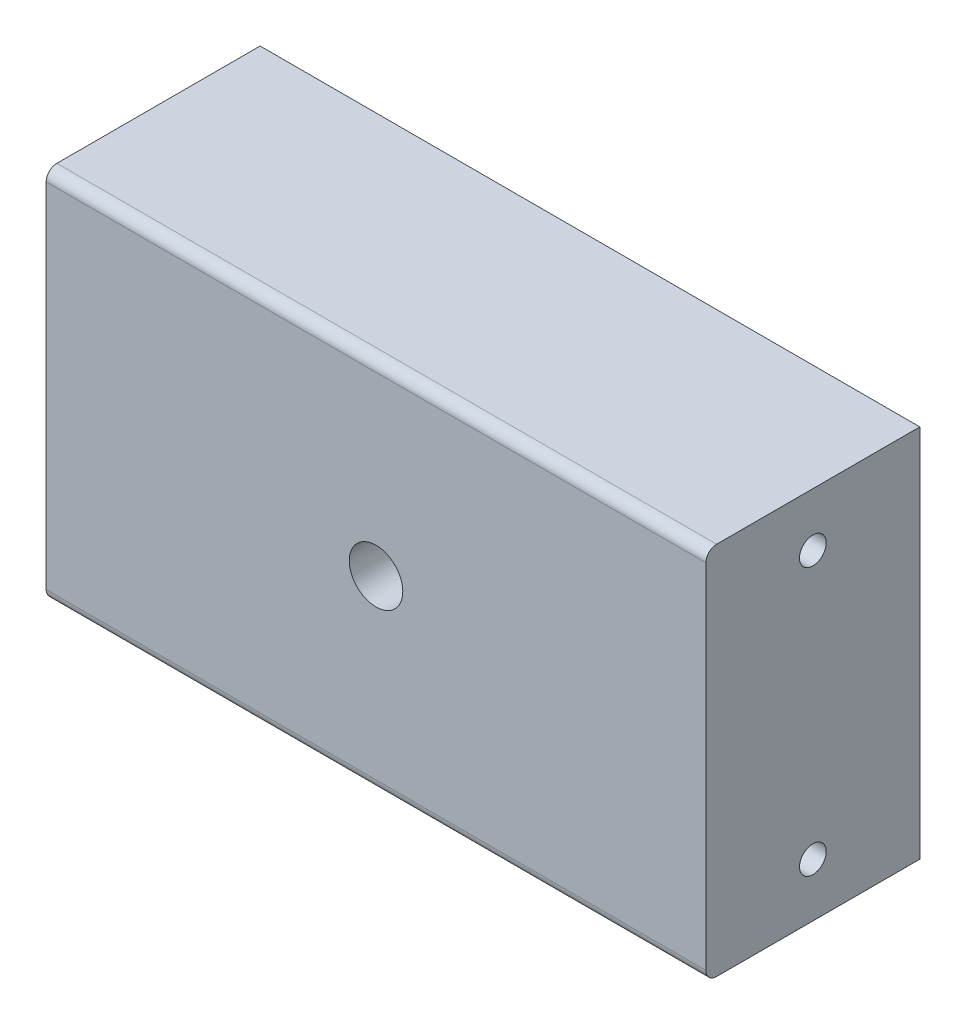
ISO-10303-21;
HEADER;
FILE_DESCRIPTION(('STEP AP214'),'2;1');
FILE_NAME('part.step','',(''),(''),'','','');
FILE_SCHEMA(('AUTOMOTIVE_DESIGN { 1 0 10303 214 1 1 1 1 }'));
ENDSEC;
DATA;
#1=APPLICATION_CONTEXT('core data for automotive mechanical design processes');
#2=APPLICATION_PROTOCOL_DEFINITION('international standard','automotive_design',2000,#1);
#3=PRODUCT_CONTEXT('',#1,'mechanical');
#4=PRODUCT('Part','Part','',(#3));
#5=PRODUCT_RELATED_PRODUCT_CATEGORY('part','',(#4));
#6=PRODUCT_DEFINITION_FORMATION('','',#4);
#7=PRODUCT_DEFINITION_CONTEXT('part definition',#1,'design');
#8=PRODUCT_DEFINITION('design','',#6,#7);
#9=PRODUCT_DEFINITION_SHAPE('','',#8);
#10=(LENGTH_UNIT() NAMED_UNIT(*) SI_UNIT(.MILLI.,.METRE.));
#11=(NAMED_UNIT(*) PLANE_ANGLE_UNIT() SI_UNIT($,.RADIAN.));
#12=(NAMED_UNIT(*) SI_UNIT($,.STERADIAN.) SOLID_ANGLE_UNIT());
#13=UNCERTAINTY_MEASURE_WITH_UNIT(LENGTH_MEASURE(1.E-05),#10,'distance_accuracy_value','');
#14=(GEOMETRIC_REPRESENTATION_CONTEXT(3) GLOBAL_UNCERTAINTY_ASSIGNED_CONTEXT((#13)) GLOBAL_UNIT_ASSIGNED_CONTEXT((#10,
#11,#12)) REPRESENTATION_CONTEXT('',''));
#15=CARTESIAN_POINT('',(0.,0.,0.));
#16=DIRECTION('',(0.,0.,1.));
#17=DIRECTION('',(1.,0.,0.));
#18=AXIS2_PLACEMENT_3D('',#15,#16,#17);
#19=CARTESIAN_POINT('',(-30.8375,17.5,-20.));
#20=DIRECTION('',(-1.,0.,0.));
#21=DIRECTION('',(0.,0.,1.));
#22=AXIS2_PLACEMENT_3D('',#19,#20,#21);
#23=PLANE('',#22);
#24=CARTESIAN_POINT('',(-30.8375,12.5,-10.));
#25=DIRECTION('',(-1.,0.,0.));
#26=DIRECTION('',(0.,0.,1.));
#27=AXIS2_PLACEMENT_3D('',#24,#25,#26);
#28=CIRCLE('',#27,1.24999999999999);
#29=CARTESIAN_POINT('',(-30.8375,12.5,-8.75000000000001));
#30=VERTEX_POINT('',#29);
#31=EDGE_CURVE('E117',#30,#30,#28,.T.);
#32=ORIENTED_EDGE('',*,*,#31,.F.);
#33=EDGE_LOOP('',(#32));
#34=FACE_BOUND('',#33,.T.);
#35=CARTESIAN_POINT('',(-30.8375,-12.5,-10.));
#36=DIRECTION('',(-1.,0.,0.));
#37=DIRECTION('',(0.,0.,1.));
#38=AXIS2_PLACEMENT_3D('',#35,#36,#37);
#39=CIRCLE('',#38,1.24999999999999);
#40=CARTESIAN_POINT('',(-30.8375,-12.5,-8.75000000000001));
#41=VERTEX_POINT('',#40);
#42=EDGE_CURVE('E116',#41,#41,#39,.T.);
#43=ORIENTED_EDGE('',*,*,#42,.F.);
#44=EDGE_LOOP('',(#43));
#45=FACE_BOUND('',#44,.T.);
#46=DIRECTION('',(0.,0.,1.));
#47=VECTOR('',#46,1.);
#48=CARTESIAN_POINT('',(-30.8375,-17.5,-20.));
#49=LINE('',#48,#47);
#50=CARTESIAN_POINT('',(-30.8375,-17.5,-20.));
#51=VERTEX_POINT('',#50);
#52=CARTESIAN_POINT('',(-30.8375,-17.5,-1.));
#53=VERTEX_POINT('',#52);
#54=EDGE_CURVE('E170',#51,#53,#49,.T.);
#55=ORIENTED_EDGE('',*,*,#54,.T.);
#56=CARTESIAN_POINT('',(-30.8375,-16.5,-1.));
#57=DIRECTION('',(-1.,0.,0.));
#58=DIRECTION('',(0.,0.,1.));
#59=AXIS2_PLACEMENT_3D('',#56,#57,#58);
#60=CIRCLE('',#59,1.);
#61=CARTESIAN_POINT('',(-30.8375,-16.5,0.));
#62=VERTEX_POINT('',#61);
#63=EDGE_CURVE('E48',#53,#62,#60,.T.);
#64=ORIENTED_EDGE('',*,*,#63,.T.);
#65=DIRECTION('',(0.,-1.,0.));
#66=VECTOR('',#65,1.);
#67=CARTESIAN_POINT('',(-30.8375,17.5,0.));
#68=LINE('',#67,#66);
#69=CARTESIAN_POINT('',(-30.8375,16.5,0.));
#70=VERTEX_POINT('',#69);
#71=EDGE_CURVE('E154',#70,#62,#68,.T.);
#72=ORIENTED_EDGE('',*,*,#71,.F.);
#73=CARTESIAN_POINT('',(-30.8375,16.5,-1.));
#74=DIRECTION('',(-1.,0.,0.));
#75=DIRECTION('',(0.,0.,1.));
#76=AXIS2_PLACEMENT_3D('',#73,#74,#75);
#77=CIRCLE('',#76,1.);
#78=CARTESIAN_POINT('',(-30.8375,17.5,-1.));
#79=VERTEX_POINT('',#78);
#80=EDGE_CURVE('E55',#70,#79,#77,.T.);
#81=ORIENTED_EDGE('',*,*,#80,.T.);
#82=DIRECTION('',(0.,0.,1.));
#83=VECTOR('',#82,1.);
#84=CARTESIAN_POINT('',(-30.8375,17.5,-20.));
#85=LINE('',#84,#83);
#86=CARTESIAN_POINT('',(-30.8375,17.5,-20.));
#87=VERTEX_POINT('',#86);
#88=EDGE_CURVE('E177',#87,#79,#85,.T.);
#89=ORIENTED_EDGE('',*,*,#88,.F.);
#90=DIRECTION('',(0.,-1.,0.));
#91=VECTOR('',#90,1.);
#92=CARTESIAN_POINT('',(-30.8375,17.5,-20.));
#93=LINE('',#92,#91);
#94=EDGE_CURVE('E155',#87,#51,#93,.T.);
#95=ORIENTED_EDGE('',*,*,#94,.T.);
#96=EDGE_LOOP('',(#55,#64,#72,#81,#89,#95));
#97=FACE_BOUND('',#96,.T.);
#98=ADVANCED_FACE('F39',(#34,#45,#97),#23,.T.);
#99=CARTESIAN_POINT('',(-30.8375,17.5,-20.));
#100=DIRECTION('',(0.,-1.,0.));
#101=DIRECTION('',(1.,0.,0.));
#102=AXIS2_PLACEMENT_3D('',#99,#100,#101);
#103=PLANE('',#102);
#104=ORIENTED_EDGE('',*,*,#88,.T.);
#105=DIRECTION('',(1.,0.,0.));
#106=VECTOR('',#105,1.);
#107=CARTESIAN_POINT('',(30.8375,17.5,-1.));
#108=LINE('',#107,#106);
#109=CARTESIAN_POINT('',(30.8375,17.5,-1.));
#110=VERTEX_POINT('',#109);
#111=EDGE_CURVE('E11',#79,#110,#108,.T.);
#112=ORIENTED_EDGE('',*,*,#111,.T.);
#113=DIRECTION('',(0.,0.,1.));
#114=VECTOR('',#113,1.);
#115=CARTESIAN_POINT('',(30.8375,17.5,-20.));
#116=LINE('',#115,#114);
#117=CARTESIAN_POINT('',(30.8375,17.5,-20.));
#118=VERTEX_POINT('',#117);
#119=EDGE_CURVE('E181',#118,#110,#116,.T.);
#120=ORIENTED_EDGE('',*,*,#119,.F.);
#121=DIRECTION('',(1.,0.,0.));
#122=VECTOR('',#121,1.);
#123=CARTESIAN_POINT('',(-30.8375,17.5,-20.));
#124=LINE('',#123,#122);
#125=EDGE_CURVE('E167',#87,#118,#124,.T.);
#126=ORIENTED_EDGE('',*,*,#125,.F.);
#127=EDGE_LOOP('',(#104,#112,#120,#126));
#128=FACE_BOUND('',#127,.T.);
#129=ADVANCED_FACE('F227',(#128),#103,.F.);
#130=CARTESIAN_POINT('',(30.8375,17.5,-20.));
#131=DIRECTION('',(-1.,0.,0.));
#132=DIRECTION('',(0.,0.,1.));
#133=AXIS2_PLACEMENT_3D('',#130,#131,#132);
#134=PLANE('',#133);
#135=CARTESIAN_POINT('',(30.8375,12.5,-10.));
#136=DIRECTION('',(1.,0.,0.));
#137=DIRECTION('',(0.,0.,-1.));
#138=AXIS2_PLACEMENT_3D('',#135,#136,#137);
#139=CIRCLE('',#138,1.24999999999999);
#140=CARTESIAN_POINT('',(30.8375,12.5,-11.25));
#141=VERTEX_POINT('',#140);
#142=EDGE_CURVE('E130',#141,#141,#139,.T.);
#143=ORIENTED_EDGE('',*,*,#142,.F.);
#144=EDGE_LOOP('',(#143));
#145=FACE_BOUND('',#144,.T.);
#146=CARTESIAN_POINT('',(30.8375,-12.5,-10.));
#147=DIRECTION('',(1.,0.,0.));
#148=DIRECTION('',(0.,0.,-1.));
#149=AXIS2_PLACEMENT_3D('',#146,#147,#148);
#150=CIRCLE('',#149,1.24999999999999);
#151=CARTESIAN_POINT('',(30.8375,-12.5,-11.25));
#152=VERTEX_POINT('',#151);
#153=EDGE_CURVE('E138',#152,#152,#150,.T.);
#154=ORIENTED_EDGE('',*,*,#153,.F.);
#155=EDGE_LOOP('',(#154));
#156=FACE_BOUND('',#155,.T.);
#157=DIRECTION('',(0.,-1.,0.));
#158=VECTOR('',#157,1.);
#159=CARTESIAN_POINT('',(30.8375,17.5,0.));
#160=LINE('',#159,#158);
#161=CARTESIAN_POINT('',(30.8375,16.5,0.));
#162=VERTEX_POINT('',#161);
#163=CARTESIAN_POINT('',(30.8375,-16.5,0.));
#164=VERTEX_POINT('',#163);
#165=EDGE_CURVE('E160',#162,#164,#160,.T.);
#166=ORIENTED_EDGE('',*,*,#165,.T.);
#167=CARTESIAN_POINT('',(30.8375,-16.5,-1.));
#168=DIRECTION('',(-1.,0.,0.));
#169=DIRECTION('',(0.,0.,1.));
#170=AXIS2_PLACEMENT_3D('',#167,#168,#169);
#171=CIRCLE('',#170,1.);
#172=CARTESIAN_POINT('',(30.8375,-17.5,-1.));
#173=VERTEX_POINT('',#172);
#174=EDGE_CURVE('E199',#164,#173,#171,.F.);
#175=ORIENTED_EDGE('',*,*,#174,.T.);
#176=DIRECTION('',(0.,0.,1.));
#177=VECTOR('',#176,1.);
#178=CARTESIAN_POINT('',(30.8375,-17.5,-20.));
#179=LINE('',#178,#177);
#180=CARTESIAN_POINT('',(30.8375,-17.5,-20.));
#181=VERTEX_POINT('',#180);
#182=EDGE_CURVE('E185',#181,#173,#179,.T.);
#183=ORIENTED_EDGE('',*,*,#182,.F.);
#184=DIRECTION('',(0.,-1.,0.));
#185=VECTOR('',#184,1.);
#186=CARTESIAN_POINT('',(30.8375,17.5,-20.));
#187=LINE('',#186,#185);
#188=EDGE_CURVE('E164',#118,#181,#187,.T.);
#189=ORIENTED_EDGE('',*,*,#188,.F.);
#190=ORIENTED_EDGE('',*,*,#119,.T.);
#191=CARTESIAN_POINT('',(30.8375,16.5,-1.));
#192=DIRECTION('',(-1.,0.,0.));
#193=DIRECTION('',(0.,0.,1.));
#194=AXIS2_PLACEMENT_3D('',#191,#192,#193);
#195=CIRCLE('',#194,1.);
#196=EDGE_CURVE('E196',#110,#162,#195,.F.);
#197=ORIENTED_EDGE('',*,*,#196,.T.);
#198=EDGE_LOOP('',(#166,#175,#183,#189,#190,#197));
#199=FACE_BOUND('',#198,.T.);
#200=ADVANCED_FACE('F216',(#145,#156,#199),#134,.F.);
#201=CARTESIAN_POINT('',(-30.8375,-17.5,-20.));
#202=DIRECTION('',(0.,-1.,0.));
#203=DIRECTION('',(1.,0.,0.));
#204=AXIS2_PLACEMENT_3D('',#201,#202,#203);
#205=PLANE('',#204);
#206=ORIENTED_EDGE('',*,*,#182,.T.);
#207=DIRECTION('',(1.,0.,0.));
#208=VECTOR('',#207,1.);
#209=CARTESIAN_POINT('',(-30.8375,-17.5,-1.));
#210=LINE('',#209,#208);
#211=EDGE_CURVE('E63',#173,#53,#210,.F.);
#212=ORIENTED_EDGE('',*,*,#211,.T.);
#213=ORIENTED_EDGE('',*,*,#54,.F.);
#214=DIRECTION('',(1.,0.,0.));
#215=VECTOR('',#214,1.);
#216=CARTESIAN_POINT('',(-30.8375,-17.5,-20.));
#217=LINE('',#216,#215);
#218=EDGE_CURVE('E159',#51,#181,#217,.T.);
#219=ORIENTED_EDGE('',*,*,#218,.T.);
#220=EDGE_LOOP('',(#206,#212,#213,#219));
#221=FACE_BOUND('',#220,.T.);
#222=ADVANCED_FACE('F218',(#221),#205,.T.);
#223=CARTESIAN_POINT('',(0.,0.,-20.));
#224=DIRECTION('',(0.,0.,1.));
#225=DIRECTION('',(1.,0.,0.));
#226=AXIS2_PLACEMENT_3D('',#223,#224,#225);
#227=PLANE('',#226);
#228=CARTESIAN_POINT('',(0.,0.,-20.));
#229=DIRECTION('',(0.,0.,1.));
#230=DIRECTION('',(1.,0.,0.));
#231=AXIS2_PLACEMENT_3D('',#228,#229,#230);
#232=CIRCLE('',#231,2.5);
#233=CARTESIAN_POINT('',(2.5,0.,-20.));
#234=VERTEX_POINT('',#233);
#235=EDGE_CURVE('E150',#234,#234,#232,.T.);
#236=ORIENTED_EDGE('',*,*,#235,.T.);
#237=EDGE_LOOP('',(#236));
#238=FACE_BOUND('',#237,.T.);
#239=ORIENTED_EDGE('',*,*,#94,.F.);
#240=ORIENTED_EDGE('',*,*,#125,.T.);
#241=ORIENTED_EDGE('',*,*,#188,.T.);
#242=ORIENTED_EDGE('',*,*,#218,.F.);
#243=EDGE_LOOP('',(#239,#240,#241,#242));
#244=FACE_BOUND('',#243,.T.);
#245=ADVANCED_FACE('F222',(#238,#244),#227,.F.);
#246=CARTESIAN_POINT('',(0.,0.,0.));
#247=DIRECTION('',(0.,0.,1.));
#248=DIRECTION('',(1.,0.,0.));
#249=AXIS2_PLACEMENT_3D('',#246,#247,#248);
#250=PLANE('',#249);
#251=CARTESIAN_POINT('',(0.,0.,0.));
#252=DIRECTION('',(0.,0.,1.));
#253=DIRECTION('',(1.,0.,0.));
#254=AXIS2_PLACEMENT_3D('',#251,#252,#253);
#255=CIRCLE('',#254,2.5);
#256=CARTESIAN_POINT('',(2.5,0.,0.));
#257=VERTEX_POINT('',#256);
#258=EDGE_CURVE('E146',#257,#257,#255,.T.);
#259=ORIENTED_EDGE('',*,*,#258,.F.);
#260=EDGE_LOOP('',(#259));
#261=FACE_BOUND('',#260,.T.);
#262=ORIENTED_EDGE('',*,*,#71,.T.);
#263=DIRECTION('',(1.,0.,0.));
#264=VECTOR('',#263,1.);
#265=CARTESIAN_POINT('',(0.,-16.5,0.));
#266=LINE('',#265,#264);
#267=EDGE_CURVE('E192',#62,#164,#266,.T.);
#268=ORIENTED_EDGE('',*,*,#267,.T.);
#269=ORIENTED_EDGE('',*,*,#165,.F.);
#270=DIRECTION('',(1.,0.,0.));
#271=VECTOR('',#270,1.);
#272=CARTESIAN_POINT('',(-30.8375,16.5,0.));
#273=LINE('',#272,#271);
#274=EDGE_CURVE('E180',#162,#70,#273,.F.);
#275=ORIENTED_EDGE('',*,*,#274,.T.);
#276=EDGE_LOOP('',(#262,#268,#269,#275));
#277=FACE_BOUND('',#276,.T.);
#278=ADVANCED_FACE('F210',(#261,#277),#250,.T.);
#279=CARTESIAN_POINT('',(0.,0.,0.));
#280=DIRECTION('',(0.,0.,1.));
#281=DIRECTION('',(1.,0.,0.));
#282=AXIS2_PLACEMENT_3D('',#279,#280,#281);
#283=CYLINDRICAL_SURFACE('',#282,2.5);
#284=ORIENTED_EDGE('',*,*,#235,.F.);
#285=EDGE_LOOP('',(#284));
#286=FACE_BOUND('',#285,.T.);
#287=ORIENTED_EDGE('',*,*,#258,.T.);
#288=EDGE_LOOP('',(#287));
#289=FACE_BOUND('',#288,.T.);
#290=ADVANCED_FACE('F250',(#286,#289),#283,.F.);
#291=CARTESIAN_POINT('',(23.3375,-12.5,-10.));
#292=DIRECTION('',(1.,0.,0.));
#293=DIRECTION('',(0.,0.,-1.));
#294=AXIS2_PLACEMENT_3D('',#291,#292,#293);
#295=CONICAL_SURFACE('',#294,1.25,1.02974425867665);
#296=CARTESIAN_POINT('',(22.5864242262155,-12.5,-10.));
#297=VERTEX_POINT('',#296);
#298=VERTEX_LOOP('',#297);
#299=FACE_BOUND('',#298,.T.);
#300=CARTESIAN_POINT('',(23.3375,-12.5,-10.));
#301=DIRECTION('',(1.,0.,0.));
#302=DIRECTION('',(0.,0.,-1.));
#303=AXIS2_PLACEMENT_3D('',#300,#301,#302);
#304=CIRCLE('',#303,1.25);
#305=CARTESIAN_POINT('',(23.3375,-12.5,-11.25));
#306=VERTEX_POINT('',#305);
#307=EDGE_CURVE('E142',#306,#306,#304,.T.);
#308=ORIENTED_EDGE('',*,*,#307,.T.);
#309=EDGE_LOOP('',(#308));
#310=FACE_BOUND('',#309,.T.);
#311=ADVANCED_FACE('F257',(#299,#310),#295,.F.);
#312=CARTESIAN_POINT('',(30.8375,-12.5,-10.));
#313=DIRECTION('',(1.,0.,0.));
#314=DIRECTION('',(0.,0.,-1.));
#315=AXIS2_PLACEMENT_3D('',#312,#313,#314);
#316=CYLINDRICAL_SURFACE('',#315,1.24999999999999);
#317=ORIENTED_EDGE('',*,*,#307,.F.);
#318=EDGE_LOOP('',(#317));
#319=FACE_BOUND('',#318,.T.);
#320=ORIENTED_EDGE('',*,*,#153,.T.);
#321=EDGE_LOOP('',(#320));
#322=FACE_BOUND('',#321,.T.);
#323=ADVANCED_FACE('F261',(#319,#322),#316,.F.);
#324=CARTESIAN_POINT('',(23.3375,12.5,-10.));
#325=DIRECTION('',(1.,0.,0.));
#326=DIRECTION('',(0.,0.,-1.));
#327=AXIS2_PLACEMENT_3D('',#324,#325,#326);
#328=CONICAL_SURFACE('',#327,1.25,1.02974425867665);
#329=CARTESIAN_POINT('',(22.5864242262155,12.5,-10.));
#330=VERTEX_POINT('',#329);
#331=VERTEX_LOOP('',#330);
#332=FACE_BOUND('',#331,.T.);
#333=CARTESIAN_POINT('',(23.3375,12.5,-10.));
#334=DIRECTION('',(1.,0.,0.));
#335=DIRECTION('',(0.,0.,-1.));
#336=AXIS2_PLACEMENT_3D('',#333,#334,#335);
#337=CIRCLE('',#336,1.25);
#338=CARTESIAN_POINT('',(23.3375,12.5,-11.25));
#339=VERTEX_POINT('',#338);
#340=EDGE_CURVE('E134',#339,#339,#337,.T.);
#341=ORIENTED_EDGE('',*,*,#340,.T.);
#342=EDGE_LOOP('',(#341));
#343=FACE_BOUND('',#342,.T.);
#344=ADVANCED_FACE('F265',(#332,#343),#328,.F.);
#345=CARTESIAN_POINT('',(30.8375,12.5,-10.));
#346=DIRECTION('',(1.,0.,0.));
#347=DIRECTION('',(0.,0.,-1.));
#348=AXIS2_PLACEMENT_3D('',#345,#346,#347);
#349=CYLINDRICAL_SURFACE('',#348,1.24999999999999);
#350=ORIENTED_EDGE('',*,*,#340,.F.);
#351=EDGE_LOOP('',(#350));
#352=FACE_BOUND('',#351,.T.);
#353=ORIENTED_EDGE('',*,*,#142,.T.);
#354=EDGE_LOOP('',(#353));
#355=FACE_BOUND('',#354,.T.);
#356=ADVANCED_FACE('F269',(#352,#355),#349,.F.);
#357=CARTESIAN_POINT('',(-23.3375,-12.5,-10.));
#358=DIRECTION('',(-1.,0.,0.));
#359=DIRECTION('',(0.,0.,1.));
#360=AXIS2_PLACEMENT_3D('',#357,#358,#359);
#361=CONICAL_SURFACE('',#360,1.25,1.02974425867665);
#362=CARTESIAN_POINT('',(-22.5864242262155,-12.5,-10.));
#363=VERTEX_POINT('',#362);
#364=VERTEX_LOOP('',#363);
#365=FACE_BOUND('',#364,.T.);
#366=CARTESIAN_POINT('',(-23.3375,-12.5,-10.));
#367=DIRECTION('',(-1.,0.,0.));
#368=DIRECTION('',(0.,0.,1.));
#369=AXIS2_PLACEMENT_3D('',#366,#367,#368);
#370=CIRCLE('',#369,1.25);
#371=CARTESIAN_POINT('',(-23.3375,-12.5,-8.75000000000001));
#372=VERTEX_POINT('',#371);
#373=EDGE_CURVE('E122',#372,#372,#370,.T.);
#374=ORIENTED_EDGE('',*,*,#373,.T.);
#375=EDGE_LOOP('',(#374));
#376=FACE_BOUND('',#375,.T.);
#377=ADVANCED_FACE('F273',(#365,#376),#361,.F.);
#378=CARTESIAN_POINT('',(-30.8375,-12.5,-10.));
#379=DIRECTION('',(-1.,0.,0.));
#380=DIRECTION('',(0.,0.,1.));
#381=AXIS2_PLACEMENT_3D('',#378,#379,#380);
#382=CYLINDRICAL_SURFACE('',#381,1.24999999999999);
#383=ORIENTED_EDGE('',*,*,#373,.F.);
#384=EDGE_LOOP('',(#383));
#385=FACE_BOUND('',#384,.T.);
#386=ORIENTED_EDGE('',*,*,#42,.T.);
#387=EDGE_LOOP('',(#386));
#388=FACE_BOUND('',#387,.T.);
#389=ADVANCED_FACE('F109',(#385,#388),#382,.F.);
#390=CARTESIAN_POINT('',(-23.3375,12.5,-10.));
#391=DIRECTION('',(-1.,0.,0.));
#392=DIRECTION('',(0.,0.,1.));
#393=AXIS2_PLACEMENT_3D('',#390,#391,#392);
#394=CONICAL_SURFACE('',#393,1.25,1.02974425867665);
#395=CARTESIAN_POINT('',(-22.5864242262155,12.5,-10.));
#396=VERTEX_POINT('',#395);
#397=VERTEX_LOOP('',#396);
#398=FACE_BOUND('',#397,.T.);
#399=CARTESIAN_POINT('',(-23.3375,12.5,-10.));
#400=DIRECTION('',(-1.,0.,0.));
#401=DIRECTION('',(0.,0.,1.));
#402=AXIS2_PLACEMENT_3D('',#399,#400,#401);
#403=CIRCLE('',#402,1.25);
#404=CARTESIAN_POINT('',(-23.3375,12.5,-8.75000000000001));
#405=VERTEX_POINT('',#404);
#406=EDGE_CURVE('E113',#405,#405,#403,.T.);
#407=ORIENTED_EDGE('',*,*,#406,.T.);
#408=EDGE_LOOP('',(#407));
#409=FACE_BOUND('',#408,.T.);
#410=ADVANCED_FACE('F105',(#398,#409),#394,.F.);
#411=CARTESIAN_POINT('',(-30.8375,12.5,-10.));
#412=DIRECTION('',(-1.,0.,0.));
#413=DIRECTION('',(0.,0.,1.));
#414=AXIS2_PLACEMENT_3D('',#411,#412,#413);
#415=CYLINDRICAL_SURFACE('',#414,1.24999999999999);
#416=ORIENTED_EDGE('',*,*,#406,.F.);
#417=EDGE_LOOP('',(#416));
#418=FACE_BOUND('',#417,.T.);
#419=ORIENTED_EDGE('',*,*,#31,.T.);
#420=EDGE_LOOP('',(#419));
#421=FACE_BOUND('',#420,.T.);
#422=ADVANCED_FACE('F108',(#418,#421),#415,.F.);
#423=CARTESIAN_POINT('',(0.,-16.5,-1.));
#424=DIRECTION('',(1.,0.,0.));
#425=DIRECTION('',(0.,1.,0.));
#426=AXIS2_PLACEMENT_3D('',#423,#424,#425);
#427=CYLINDRICAL_SURFACE('',#426,1.);
#428=ORIENTED_EDGE('',*,*,#63,.F.);
#429=ORIENTED_EDGE('',*,*,#211,.F.);
#430=ORIENTED_EDGE('',*,*,#174,.F.);
#431=ORIENTED_EDGE('',*,*,#267,.F.);
#432=EDGE_LOOP('',(#428,#429,#430,#431));
#433=FACE_BOUND('',#432,.T.);
#434=ADVANCED_FACE('F213',(#433),#427,.T.);
#435=CARTESIAN_POINT('',(-30.8375,16.5,-1.));
#436=DIRECTION('',(-1.,0.,0.));
#437=DIRECTION('',(0.,-1.,0.));
#438=AXIS2_PLACEMENT_3D('',#435,#436,#437);
#439=CYLINDRICAL_SURFACE('',#438,1.);
#440=ORIENTED_EDGE('',*,*,#80,.F.);
#441=ORIENTED_EDGE('',*,*,#274,.F.);
#442=ORIENTED_EDGE('',*,*,#196,.F.);
#443=ORIENTED_EDGE('',*,*,#111,.F.);
#444=EDGE_LOOP('',(#440,#441,#442,#443));
#445=FACE_BOUND('',#444,.T.);
#446=ADVANCED_FACE('F41',(#445),#439,.T.);
#447=CLOSED_SHELL('',(#98,#129,#200,#222,#245,#278,#290,#311,#323,#344,#356,#377,#389,#410,#422,
#434,#446));
#448=MANIFOLD_SOLID_BREP('B2',#447);
#449=ADVANCED_BREP_SHAPE_REPRESENTATION('',(#18,#448),#14);
#450=SHAPE_DEFINITION_REPRESENTATION(#9,#449);
ENDSEC;
END-ISO-10303-21;
